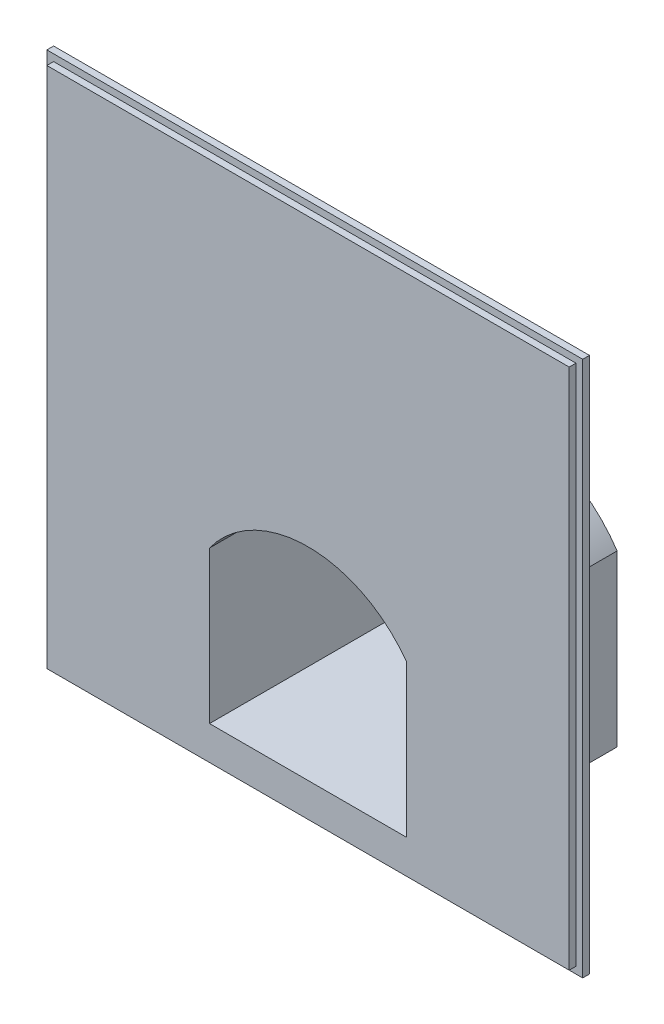
ISO-10303-21;
HEADER;
FILE_DESCRIPTION(('STEP AP214'),'2;1');
FILE_NAME('part.step','',(''),(''),'','','');
FILE_SCHEMA(('AUTOMOTIVE_DESIGN { 1 0 10303 214 1 1 1 1 }'));
ENDSEC;
DATA;
#1=APPLICATION_CONTEXT('core data for automotive mechanical design processes');
#2=APPLICATION_PROTOCOL_DEFINITION('international standard','automotive_design',2000,#1);
#3=PRODUCT_CONTEXT('',#1,'mechanical');
#4=PRODUCT('Part','Part','',(#3));
#5=PRODUCT_RELATED_PRODUCT_CATEGORY('part','',(#4));
#6=PRODUCT_DEFINITION_FORMATION('','',#4);
#7=PRODUCT_DEFINITION_CONTEXT('part definition',#1,'design');
#8=PRODUCT_DEFINITION('design','',#6,#7);
#9=PRODUCT_DEFINITION_SHAPE('','',#8);
#10=(LENGTH_UNIT() NAMED_UNIT(*) SI_UNIT(.MILLI.,.METRE.));
#11=(NAMED_UNIT(*) PLANE_ANGLE_UNIT() SI_UNIT($,.RADIAN.));
#12=(NAMED_UNIT(*) SI_UNIT($,.STERADIAN.) SOLID_ANGLE_UNIT());
#13=UNCERTAINTY_MEASURE_WITH_UNIT(LENGTH_MEASURE(1.E-05),#10,'distance_accuracy_value','');
#14=(GEOMETRIC_REPRESENTATION_CONTEXT(3) GLOBAL_UNCERTAINTY_ASSIGNED_CONTEXT((#13)) GLOBAL_UNIT_ASSIGNED_CONTEXT((#10,
#11,#12)) REPRESENTATION_CONTEXT('',''));
#15=CARTESIAN_POINT('',(0.,0.,0.));
#16=DIRECTION('',(0.,0.,1.));
#17=DIRECTION('',(1.,0.,0.));
#18=AXIS2_PLACEMENT_3D('',#15,#16,#17);
#19=CARTESIAN_POINT('',(-19.85,-19.85,1.));
#20=DIRECTION('',(0.,1.,0.));
#21=DIRECTION('',(0.,0.,1.));
#22=AXIS2_PLACEMENT_3D('',#19,#20,#21);
#23=PLANE('',#22);
#24=DIRECTION('',(1.,0.,0.));
#25=VECTOR('',#24,1.);
#26=CARTESIAN_POINT('',(-19.85,-19.85,0.5));
#27=LINE('',#26,#25);
#28=CARTESIAN_POINT('',(-19.85,-19.85,0.5));
#29=VERTEX_POINT('',#28);
#30=CARTESIAN_POINT('',(19.85,-19.85,0.5));
#31=VERTEX_POINT('',#30);
#32=EDGE_CURVE('E297',#29,#31,#27,.T.);
#33=ORIENTED_EDGE('',*,*,#32,.F.);
#34=DIRECTION('',(0.,0.,-1.));
#35=VECTOR('',#34,1.);
#36=CARTESIAN_POINT('',(-19.85,-19.85,1.));
#37=LINE('',#36,#35);
#38=CARTESIAN_POINT('',(-19.85,-19.85,0.));
#39=VERTEX_POINT('',#38);
#40=EDGE_CURVE('E380',#29,#39,#37,.T.);
#41=ORIENTED_EDGE('',*,*,#40,.T.);
#42=DIRECTION('',(1.,0.,0.));
#43=VECTOR('',#42,1.);
#44=CARTESIAN_POINT('',(-19.85,-19.85,0.));
#45=LINE('',#44,#43);
#46=CARTESIAN_POINT('',(19.85,-19.85,0.));
#47=VERTEX_POINT('',#46);
#48=EDGE_CURVE('E368',#39,#47,#45,.T.);
#49=ORIENTED_EDGE('',*,*,#48,.T.);
#50=DIRECTION('',(0.,0.,-1.));
#51=VECTOR('',#50,1.);
#52=CARTESIAN_POINT('',(19.85,-19.85,1.));
#53=LINE('',#52,#51);
#54=EDGE_CURVE('E11',#31,#47,#53,.T.);
#55=ORIENTED_EDGE('',*,*,#54,.F.);
#56=EDGE_LOOP('',(#33,#41,#49,#55));
#57=FACE_BOUND('',#56,.T.);
#58=ADVANCED_FACE('F35',(#57),#23,.F.);
#59=CARTESIAN_POINT('',(19.85,-19.85,1.));
#60=DIRECTION('',(-1.,0.,0.));
#61=DIRECTION('',(0.,-1.,0.));
#62=AXIS2_PLACEMENT_3D('',#59,#60,#61);
#63=PLANE('',#62);
#64=DIRECTION('',(0.,1.,0.));
#65=VECTOR('',#64,1.);
#66=CARTESIAN_POINT('',(19.85,-19.85,0.5));
#67=LINE('',#66,#65);
#68=CARTESIAN_POINT('',(19.85,19.85,0.5));
#69=VERTEX_POINT('',#68);
#70=EDGE_CURVE('E299',#31,#69,#67,.T.);
#71=ORIENTED_EDGE('',*,*,#70,.F.);
#72=ORIENTED_EDGE('',*,*,#54,.T.);
#73=DIRECTION('',(0.,1.,0.));
#74=VECTOR('',#73,1.);
#75=CARTESIAN_POINT('',(19.85,-19.85,0.));
#76=LINE('',#75,#74);
#77=CARTESIAN_POINT('',(19.85,19.85,0.));
#78=VERTEX_POINT('',#77);
#79=EDGE_CURVE('E371',#47,#78,#76,.T.);
#80=ORIENTED_EDGE('',*,*,#79,.T.);
#81=DIRECTION('',(0.,0.,-1.));
#82=VECTOR('',#81,1.);
#83=CARTESIAN_POINT('',(19.85,19.85,1.));
#84=LINE('',#83,#82);
#85=EDGE_CURVE('E42',#69,#78,#84,.T.);
#86=ORIENTED_EDGE('',*,*,#85,.F.);
#87=EDGE_LOOP('',(#71,#72,#80,#86));
#88=FACE_BOUND('',#87,.T.);
#89=ADVANCED_FACE('F393',(#88),#63,.F.);
#90=CARTESIAN_POINT('',(19.85,19.85,1.));
#91=DIRECTION('',(0.,-1.,0.));
#92=DIRECTION('',(1.,0.,0.));
#93=AXIS2_PLACEMENT_3D('',#90,#91,#92);
#94=PLANE('',#93);
#95=DIRECTION('',(-1.,0.,0.));
#96=VECTOR('',#95,1.);
#97=CARTESIAN_POINT('',(19.85,19.85,0.5));
#98=LINE('',#97,#96);
#99=CARTESIAN_POINT('',(-19.85,19.85,0.5));
#100=VERTEX_POINT('',#99);
#101=EDGE_CURVE('E301',#69,#100,#98,.T.);
#102=ORIENTED_EDGE('',*,*,#101,.F.);
#103=ORIENTED_EDGE('',*,*,#85,.T.);
#104=DIRECTION('',(-1.,0.,0.));
#105=VECTOR('',#104,1.);
#106=CARTESIAN_POINT('',(19.85,19.85,0.));
#107=LINE('',#106,#105);
#108=CARTESIAN_POINT('',(-19.85,19.85,0.));
#109=VERTEX_POINT('',#108);
#110=EDGE_CURVE('E374',#78,#109,#107,.T.);
#111=ORIENTED_EDGE('',*,*,#110,.T.);
#112=DIRECTION('',(0.,0.,-1.));
#113=VECTOR('',#112,1.);
#114=CARTESIAN_POINT('',(-19.85,19.85,1.));
#115=LINE('',#114,#113);
#116=EDGE_CURVE('E382',#100,#109,#115,.T.);
#117=ORIENTED_EDGE('',*,*,#116,.F.);
#118=EDGE_LOOP('',(#102,#103,#111,#117));
#119=FACE_BOUND('',#118,.T.);
#120=ADVANCED_FACE('F386',(#119),#94,.F.);
#121=CARTESIAN_POINT('',(-19.85,19.85,1.));
#122=DIRECTION('',(1.,0.,0.));
#123=DIRECTION('',(0.,1.,0.));
#124=AXIS2_PLACEMENT_3D('',#121,#122,#123);
#125=PLANE('',#124);
#126=DIRECTION('',(0.,-1.,0.));
#127=VECTOR('',#126,1.);
#128=CARTESIAN_POINT('',(-19.85,19.85,0.5));
#129=LINE('',#128,#127);
#130=EDGE_CURVE('E289',#100,#29,#129,.T.);
#131=ORIENTED_EDGE('',*,*,#130,.F.);
#132=ORIENTED_EDGE('',*,*,#116,.T.);
#133=DIRECTION('',(0.,-1.,0.));
#134=VECTOR('',#133,1.);
#135=CARTESIAN_POINT('',(-19.85,19.85,0.));
#136=LINE('',#135,#134);
#137=EDGE_CURVE('E377',#109,#39,#136,.T.);
#138=ORIENTED_EDGE('',*,*,#137,.T.);
#139=ORIENTED_EDGE('',*,*,#40,.F.);
#140=EDGE_LOOP('',(#131,#132,#138,#139));
#141=FACE_BOUND('',#140,.T.);
#142=ADVANCED_FACE('F401',(#141),#125,.F.);
#143=CARTESIAN_POINT('',(0.,0.,0.));
#144=DIRECTION('',(0.,0.,1.));
#145=DIRECTION('',(1.,0.,0.));
#146=AXIS2_PLACEMENT_3D('',#143,#144,#145);
#147=PLANE('',#146);
#148=DIRECTION('',(0.,-1.,0.));
#149=VECTOR('',#148,1.);
#150=CARTESIAN_POINT('',(8.3,-17.85,0.));
#151=LINE('',#150,#149);
#152=CARTESIAN_POINT('',(8.3,-5.27236609304627,0.));
#153=VERTEX_POINT('',#152);
#154=CARTESIAN_POINT('',(8.3,-17.85,0.));
#155=VERTEX_POINT('',#154);
#156=EDGE_CURVE('E319',#153,#155,#151,.T.);
#157=ORIENTED_EDGE('',*,*,#156,.F.);
#158=CARTESIAN_POINT('',(0.,-10.85,0.));
#159=DIRECTION('',(0.,0.,-1.));
#160=DIRECTION('',(-1.,0.,0.));
#161=AXIS2_PLACEMENT_3D('',#158,#159,#160);
#162=CIRCLE('',#161,10.);
#163=CARTESIAN_POINT('',(-8.3,-5.27236609304627,0.));
#164=VERTEX_POINT('',#163);
#165=EDGE_CURVE('E340',#164,#153,#162,.T.);
#166=ORIENTED_EDGE('',*,*,#165,.F.);
#167=DIRECTION('',(0.,1.,0.));
#168=VECTOR('',#167,1.);
#169=CARTESIAN_POINT('',(-8.3,-17.85,0.));
#170=LINE('',#169,#168);
#171=CARTESIAN_POINT('',(-8.3,-17.85,0.));
#172=VERTEX_POINT('',#171);
#173=EDGE_CURVE('E352',#172,#164,#170,.T.);
#174=ORIENTED_EDGE('',*,*,#173,.F.);
#175=DIRECTION('',(-1.,0.,0.));
#176=VECTOR('',#175,1.);
#177=CARTESIAN_POINT('',(8.3,-17.85,0.));
#178=LINE('',#177,#176);
#179=EDGE_CURVE('E349',#155,#172,#178,.T.);
#180=ORIENTED_EDGE('',*,*,#179,.F.);
#181=EDGE_LOOP('',(#157,#166,#174,#180));
#182=FACE_BOUND('',#181,.T.);
#183=ORIENTED_EDGE('',*,*,#48,.F.);
#184=ORIENTED_EDGE('',*,*,#137,.F.);
#185=ORIENTED_EDGE('',*,*,#110,.F.);
#186=ORIENTED_EDGE('',*,*,#79,.F.);
#187=EDGE_LOOP('',(#183,#184,#185,#186));
#188=FACE_BOUND('',#187,.T.);
#189=ADVANCED_FACE('F397',(#182,#188),#147,.F.);
#190=CARTESIAN_POINT('',(8.3,-17.85,-13.6));
#191=DIRECTION('',(-1.,0.,0.));
#192=DIRECTION('',(0.,0.,1.));
#193=AXIS2_PLACEMENT_3D('',#190,#191,#192);
#194=PLANE('',#193);
#195=ORIENTED_EDGE('',*,*,#156,.T.);
#196=DIRECTION('',(0.,0.,1.));
#197=VECTOR('',#196,1.);
#198=CARTESIAN_POINT('',(8.3,-17.85,-13.6));
#199=LINE('',#198,#197);
#200=CARTESIAN_POINT('',(8.3,-17.85,-13.6));
#201=VERTEX_POINT('',#200);
#202=EDGE_CURVE('E365',#201,#155,#199,.T.);
#203=ORIENTED_EDGE('',*,*,#202,.F.);
#204=DIRECTION('',(0.,-1.,0.));
#205=VECTOR('',#204,1.);
#206=CARTESIAN_POINT('',(8.3,-17.85,-13.6));
#207=LINE('',#206,#205);
#208=CARTESIAN_POINT('',(8.3,-5.27236609304627,-13.6));
#209=VERTEX_POINT('',#208);
#210=EDGE_CURVE('E336',#209,#201,#207,.T.);
#211=ORIENTED_EDGE('',*,*,#210,.F.);
#212=DIRECTION('',(0.,0.,1.));
#213=VECTOR('',#212,1.);
#214=CARTESIAN_POINT('',(8.3,-5.27236609304627,-13.6));
#215=LINE('',#214,#213);
#216=EDGE_CURVE('E346',#209,#153,#215,.T.);
#217=ORIENTED_EDGE('',*,*,#216,.T.);
#218=EDGE_LOOP('',(#195,#203,#211,#217));
#219=FACE_BOUND('',#218,.T.);
#220=ADVANCED_FACE('F419',(#219),#194,.F.);
#221=CARTESIAN_POINT('',(8.3,-17.85,-13.6));
#222=DIRECTION('',(0.,1.,0.));
#223=DIRECTION('',(0.,0.,1.));
#224=AXIS2_PLACEMENT_3D('',#221,#222,#223);
#225=PLANE('',#224);
#226=ORIENTED_EDGE('',*,*,#179,.T.);
#227=DIRECTION('',(0.,0.,1.));
#228=VECTOR('',#227,1.);
#229=CARTESIAN_POINT('',(-8.3,-17.85,-13.6));
#230=LINE('',#229,#228);
#231=CARTESIAN_POINT('',(-8.3,-17.85,-13.6));
#232=VERTEX_POINT('',#231);
#233=EDGE_CURVE('E362',#232,#172,#230,.T.);
#234=ORIENTED_EDGE('',*,*,#233,.F.);
#235=DIRECTION('',(-1.,0.,0.));
#236=VECTOR('',#235,1.);
#237=CARTESIAN_POINT('',(8.3,-17.85,-13.6));
#238=LINE('',#237,#236);
#239=EDGE_CURVE('E339',#201,#232,#238,.T.);
#240=ORIENTED_EDGE('',*,*,#239,.F.);
#241=ORIENTED_EDGE('',*,*,#202,.T.);
#242=EDGE_LOOP('',(#226,#234,#240,#241));
#243=FACE_BOUND('',#242,.T.);
#244=ADVANCED_FACE('F429',(#243),#225,.F.);
#245=CARTESIAN_POINT('',(-8.3,-17.85,-13.6));
#246=DIRECTION('',(1.,0.,0.));
#247=DIRECTION('',(0.,0.,-1.));
#248=AXIS2_PLACEMENT_3D('',#245,#246,#247);
#249=PLANE('',#248);
#250=ORIENTED_EDGE('',*,*,#173,.T.);
#251=DIRECTION('',(0.,0.,1.));
#252=VECTOR('',#251,1.);
#253=CARTESIAN_POINT('',(-8.3,-5.27236609304627,-13.6));
#254=LINE('',#253,#252);
#255=CARTESIAN_POINT('',(-8.3,-5.27236609304627,-13.6));
#256=VERTEX_POINT('',#255);
#257=EDGE_CURVE('E359',#256,#164,#254,.T.);
#258=ORIENTED_EDGE('',*,*,#257,.F.);
#259=DIRECTION('',(0.,1.,0.));
#260=VECTOR('',#259,1.);
#261=CARTESIAN_POINT('',(-8.3,-17.85,-13.6));
#262=LINE('',#261,#260);
#263=EDGE_CURVE('E342',#232,#256,#262,.T.);
#264=ORIENTED_EDGE('',*,*,#263,.F.);
#265=ORIENTED_EDGE('',*,*,#233,.T.);
#266=EDGE_LOOP('',(#250,#258,#264,#265));
#267=FACE_BOUND('',#266,.T.);
#268=ADVANCED_FACE('F433',(#267),#249,.F.);
#269=CARTESIAN_POINT('',(0.,-10.85,-13.6));
#270=DIRECTION('',(0.,0.,1.));
#271=DIRECTION('',(1.,0.,0.));
#272=AXIS2_PLACEMENT_3D('',#269,#270,#271);
#273=CYLINDRICAL_SURFACE('',#272,10.);
#274=ORIENTED_EDGE('',*,*,#165,.T.);
#275=ORIENTED_EDGE('',*,*,#216,.F.);
#276=CARTESIAN_POINT('',(0.,-10.85,-13.6));
#277=DIRECTION('',(0.,0.,-1.));
#278=DIRECTION('',(-1.,0.,0.));
#279=AXIS2_PLACEMENT_3D('',#276,#277,#278);
#280=CIRCLE('',#279,10.);
#281=EDGE_CURVE('E344',#256,#209,#280,.T.);
#282=ORIENTED_EDGE('',*,*,#281,.F.);
#283=ORIENTED_EDGE('',*,*,#257,.T.);
#284=EDGE_LOOP('',(#274,#275,#282,#283));
#285=FACE_BOUND('',#284,.T.);
#286=ADVANCED_FACE('F437',(#285),#273,.T.);
#287=CARTESIAN_POINT('',(0.,-10.85,-13.6));
#288=DIRECTION('',(0.,0.,-1.));
#289=DIRECTION('',(-1.,0.,0.));
#290=AXIS2_PLACEMENT_3D('',#287,#288,#289);
#291=PLANE('',#290);
#292=DIRECTION('',(0.,-1.,0.));
#293=VECTOR('',#292,1.);
#294=CARTESIAN_POINT('',(6.5,-15.55,-13.6));
#295=LINE('',#294,#293);
#296=CARTESIAN_POINT('',(6.5,-15.55,-13.6));
#297=VERTEX_POINT('',#296);
#298=CARTESIAN_POINT('',(6.5,-15.85,-13.6));
#299=VERTEX_POINT('',#298);
#300=EDGE_CURVE('E49',#297,#299,#295,.T.);
#301=ORIENTED_EDGE('',*,*,#300,.F.);
#302=DIRECTION('',(1.,0.,0.));
#303=VECTOR('',#302,1.);
#304=CARTESIAN_POINT('',(6.5,-15.55,-13.6));
#305=LINE('',#304,#303);
#306=CARTESIAN_POINT('',(4.5,-15.55,-13.6));
#307=VERTEX_POINT('',#306);
#308=EDGE_CURVE('E202',#307,#297,#305,.T.);
#309=ORIENTED_EDGE('',*,*,#308,.F.);
#310=DIRECTION('',(0.,1.,0.));
#311=VECTOR('',#310,1.);
#312=CARTESIAN_POINT('',(4.5,-15.55,-13.6));
#313=LINE('',#312,#311);
#314=CARTESIAN_POINT('',(4.5,-15.85,-13.6));
#315=VERTEX_POINT('',#314);
#316=EDGE_CURVE('E225',#315,#307,#313,.T.);
#317=ORIENTED_EDGE('',*,*,#316,.F.);
#318=DIRECTION('',(-1.,0.,0.));
#319=VECTOR('',#318,1.);
#320=CARTESIAN_POINT('',(6.5,-15.85,-13.6));
#321=LINE('',#320,#319);
#322=EDGE_CURVE('E218',#299,#315,#321,.T.);
#323=ORIENTED_EDGE('',*,*,#322,.F.);
#324=EDGE_LOOP('',(#301,#309,#317,#323));
#325=FACE_BOUND('',#324,.T.);
#326=DIRECTION('',(1.,0.,0.));
#327=VECTOR('',#326,1.);
#328=CARTESIAN_POINT('',(-6.5,-15.55,-13.6));
#329=LINE('',#328,#327);
#330=CARTESIAN_POINT('',(-6.5,-15.55,-13.6));
#331=VERTEX_POINT('',#330);
#332=CARTESIAN_POINT('',(-4.5,-15.55,-13.6));
#333=VERTEX_POINT('',#332);
#334=EDGE_CURVE('E57',#331,#333,#329,.T.);
#335=ORIENTED_EDGE('',*,*,#334,.F.);
#336=DIRECTION('',(0.,1.,0.));
#337=VECTOR('',#336,1.);
#338=CARTESIAN_POINT('',(-6.5,-15.55,-13.6));
#339=LINE('',#338,#337);
#340=CARTESIAN_POINT('',(-6.5,-15.85,-13.6));
#341=VERTEX_POINT('',#340);
#342=EDGE_CURVE('E249',#341,#331,#339,.T.);
#343=ORIENTED_EDGE('',*,*,#342,.F.);
#344=DIRECTION('',(-1.,0.,0.));
#345=VECTOR('',#344,1.);
#346=CARTESIAN_POINT('',(-6.5,-15.85,-13.6));
#347=LINE('',#346,#345);
#348=CARTESIAN_POINT('',(-4.5,-15.85,-13.6));
#349=VERTEX_POINT('',#348);
#350=EDGE_CURVE('E246',#349,#341,#347,.T.);
#351=ORIENTED_EDGE('',*,*,#350,.F.);
#352=DIRECTION('',(0.,-1.,0.));
#353=VECTOR('',#352,1.);
#354=CARTESIAN_POINT('',(-4.5,-15.55,-13.6));
#355=LINE('',#354,#353);
#356=EDGE_CURVE('E243',#333,#349,#355,.T.);
#357=ORIENTED_EDGE('',*,*,#356,.F.);
#358=EDGE_LOOP('',(#335,#343,#351,#357));
#359=FACE_BOUND('',#358,.T.);
#360=ORIENTED_EDGE('',*,*,#210,.T.);
#361=ORIENTED_EDGE('',*,*,#239,.T.);
#362=ORIENTED_EDGE('',*,*,#263,.T.);
#363=ORIENTED_EDGE('',*,*,#281,.T.);
#364=EDGE_LOOP('',(#360,#361,#362,#363));
#365=FACE_BOUND('',#364,.T.);
#366=ADVANCED_FACE('F441',(#325,#359,#365),#291,.T.);
#367=CARTESIAN_POINT('',(0.,0.,0.5));
#368=DIRECTION('',(0.,0.,1.));
#369=DIRECTION('',(1.,0.,0.));
#370=AXIS2_PLACEMENT_3D('',#367,#368,#369);
#371=PLANE('',#370);
#372=DIRECTION('',(-1.,0.,0.));
#373=VECTOR('',#372,1.);
#374=CARTESIAN_POINT('',(-19.35,19.35,0.5));
#375=LINE('',#374,#373);
#376=CARTESIAN_POINT('',(19.35,19.35,0.5));
#377=VERTEX_POINT('',#376);
#378=CARTESIAN_POINT('',(-19.35,19.35,0.5));
#379=VERTEX_POINT('',#378);
#380=EDGE_CURVE('E273',#377,#379,#375,.T.);
#381=ORIENTED_EDGE('',*,*,#380,.F.);
#382=DIRECTION('',(0.,1.,0.));
#383=VECTOR('',#382,1.);
#384=CARTESIAN_POINT('',(19.35,19.35,0.5));
#385=LINE('',#384,#383);
#386=CARTESIAN_POINT('',(19.35,-19.35,0.5));
#387=VERTEX_POINT('',#386);
#388=EDGE_CURVE('E270',#387,#377,#385,.T.);
#389=ORIENTED_EDGE('',*,*,#388,.F.);
#390=DIRECTION('',(1.,0.,0.));
#391=VECTOR('',#390,1.);
#392=CARTESIAN_POINT('',(-19.35,-19.35,0.5));
#393=LINE('',#392,#391);
#394=CARTESIAN_POINT('',(-19.35,-19.35,0.5));
#395=VERTEX_POINT('',#394);
#396=EDGE_CURVE('E266',#395,#387,#393,.T.);
#397=ORIENTED_EDGE('',*,*,#396,.F.);
#398=DIRECTION('',(0.,-1.,0.));
#399=VECTOR('',#398,1.);
#400=CARTESIAN_POINT('',(-19.35,19.35,0.5));
#401=LINE('',#400,#399);
#402=EDGE_CURVE('E263',#379,#395,#401,.T.);
#403=ORIENTED_EDGE('',*,*,#402,.F.);
#404=EDGE_LOOP('',(#381,#389,#397,#403));
#405=FACE_BOUND('',#404,.T.);
#406=ORIENTED_EDGE('',*,*,#130,.T.);
#407=ORIENTED_EDGE('',*,*,#32,.T.);
#408=ORIENTED_EDGE('',*,*,#70,.T.);
#409=ORIENTED_EDGE('',*,*,#101,.T.);
#410=EDGE_LOOP('',(#406,#407,#408,#409));
#411=FACE_BOUND('',#410,.T.);
#412=ADVANCED_FACE('F404',(#405,#411),#371,.T.);
#413=CARTESIAN_POINT('',(-19.35,19.35,0.5));
#414=DIRECTION('',(-1.,0.,0.));
#415=DIRECTION('',(0.,-1.,0.));
#416=AXIS2_PLACEMENT_3D('',#413,#414,#415);
#417=PLANE('',#416);
#418=DIRECTION('',(0.,-1.,0.));
#419=VECTOR('',#418,1.);
#420=CARTESIAN_POINT('',(-19.35,19.35,1.));
#421=LINE('',#420,#419);
#422=CARTESIAN_POINT('',(-19.35,19.35,1.));
#423=VERTEX_POINT('',#422);
#424=CARTESIAN_POINT('',(-19.35,-19.35,1.));
#425=VERTEX_POINT('',#424);
#426=EDGE_CURVE('E210',#423,#425,#421,.T.);
#427=ORIENTED_EDGE('',*,*,#426,.F.);
#428=DIRECTION('',(0.,0.,1.));
#429=VECTOR('',#428,1.);
#430=CARTESIAN_POINT('',(-19.35,19.35,0.5));
#431=LINE('',#430,#429);
#432=EDGE_CURVE('E287',#379,#423,#431,.T.);
#433=ORIENTED_EDGE('',*,*,#432,.F.);
#434=ORIENTED_EDGE('',*,*,#402,.T.);
#435=DIRECTION('',(0.,0.,1.));
#436=VECTOR('',#435,1.);
#437=CARTESIAN_POINT('',(-19.35,-19.35,0.5));
#438=LINE('',#437,#436);
#439=EDGE_CURVE('E276',#395,#425,#438,.T.);
#440=ORIENTED_EDGE('',*,*,#439,.T.);
#441=EDGE_LOOP('',(#427,#433,#434,#440));
#442=FACE_BOUND('',#441,.T.);
#443=ADVANCED_FACE('F466',(#442),#417,.T.);
#444=CARTESIAN_POINT('',(-19.35,19.35,0.5));
#445=DIRECTION('',(0.,1.,0.));
#446=DIRECTION('',(0.,0.,1.));
#447=AXIS2_PLACEMENT_3D('',#444,#445,#446);
#448=PLANE('',#447);
#449=DIRECTION('',(-1.,0.,0.));
#450=VECTOR('',#449,1.);
#451=CARTESIAN_POINT('',(-19.35,19.35,1.));
#452=LINE('',#451,#450);
#453=CARTESIAN_POINT('',(19.35,19.35,1.));
#454=VERTEX_POINT('',#453);
#455=EDGE_CURVE('E267',#454,#423,#452,.T.);
#456=ORIENTED_EDGE('',*,*,#455,.F.);
#457=DIRECTION('',(0.,0.,1.));
#458=VECTOR('',#457,1.);
#459=CARTESIAN_POINT('',(19.35,19.35,0.5));
#460=LINE('',#459,#458);
#461=EDGE_CURVE('E290',#377,#454,#460,.T.);
#462=ORIENTED_EDGE('',*,*,#461,.F.);
#463=ORIENTED_EDGE('',*,*,#380,.T.);
#464=ORIENTED_EDGE('',*,*,#432,.T.);
#465=EDGE_LOOP('',(#456,#462,#463,#464));
#466=FACE_BOUND('',#465,.T.);
#467=ADVANCED_FACE('F470',(#466),#448,.T.);
#468=CARTESIAN_POINT('',(19.35,19.35,0.5));
#469=DIRECTION('',(1.,0.,0.));
#470=DIRECTION('',(0.,1.,0.));
#471=AXIS2_PLACEMENT_3D('',#468,#469,#470);
#472=PLANE('',#471);
#473=DIRECTION('',(0.,1.,0.));
#474=VECTOR('',#473,1.);
#475=CARTESIAN_POINT('',(19.35,19.35,1.));
#476=LINE('',#475,#474);
#477=CARTESIAN_POINT('',(19.35,-19.35,1.));
#478=VERTEX_POINT('',#477);
#479=EDGE_CURVE('E282',#478,#454,#476,.T.);
#480=ORIENTED_EDGE('',*,*,#479,.F.);
#481=DIRECTION('',(0.,0.,1.));
#482=VECTOR('',#481,1.);
#483=CARTESIAN_POINT('',(19.35,-19.35,0.5));
#484=LINE('',#483,#482);
#485=EDGE_CURVE('E292',#387,#478,#484,.T.);
#486=ORIENTED_EDGE('',*,*,#485,.F.);
#487=ORIENTED_EDGE('',*,*,#388,.T.);
#488=ORIENTED_EDGE('',*,*,#461,.T.);
#489=EDGE_LOOP('',(#480,#486,#487,#488));
#490=FACE_BOUND('',#489,.T.);
#491=ADVANCED_FACE('F474',(#490),#472,.T.);
#492=CARTESIAN_POINT('',(-19.35,-19.35,0.5));
#493=DIRECTION('',(0.,-1.,0.));
#494=DIRECTION('',(0.,0.,-1.));
#495=AXIS2_PLACEMENT_3D('',#492,#493,#494);
#496=PLANE('',#495);
#497=DIRECTION('',(1.,0.,0.));
#498=VECTOR('',#497,1.);
#499=CARTESIAN_POINT('',(-19.35,-19.35,1.));
#500=LINE('',#499,#498);
#501=EDGE_CURVE('E279',#425,#478,#500,.T.);
#502=ORIENTED_EDGE('',*,*,#501,.F.);
#503=ORIENTED_EDGE('',*,*,#439,.F.);
#504=ORIENTED_EDGE('',*,*,#396,.T.);
#505=ORIENTED_EDGE('',*,*,#485,.T.);
#506=EDGE_LOOP('',(#502,#503,#504,#505));
#507=FACE_BOUND('',#506,.T.);
#508=ADVANCED_FACE('F449',(#507),#496,.T.);
#509=CARTESIAN_POINT('',(0.,-10.85,-12.6));
#510=DIRECTION('',(0.,0.,-1.));
#511=DIRECTION('',(-1.,0.,0.));
#512=AXIS2_PLACEMENT_3D('',#509,#510,#511);
#513=PLANE('',#512);
#514=DIRECTION('',(-1.,0.,0.));
#515=VECTOR('',#514,1.);
#516=CARTESIAN_POINT('',(6.5,-15.55,-12.6));
#517=LINE('',#516,#515);
#518=CARTESIAN_POINT('',(6.5,-15.55,-12.6));
#519=VERTEX_POINT('',#518);
#520=CARTESIAN_POINT('',(4.5,-15.55,-12.6));
#521=VERTEX_POINT('',#520);
#522=EDGE_CURVE('E216',#519,#521,#517,.T.);
#523=ORIENTED_EDGE('',*,*,#522,.F.);
#524=DIRECTION('',(0.,1.,0.));
#525=VECTOR('',#524,1.);
#526=CARTESIAN_POINT('',(6.5,-15.55,-12.6));
#527=LINE('',#526,#525);
#528=CARTESIAN_POINT('',(6.5,-15.85,-12.6));
#529=VERTEX_POINT('',#528);
#530=EDGE_CURVE('E196',#529,#519,#527,.T.);
#531=ORIENTED_EDGE('',*,*,#530,.F.);
#532=DIRECTION('',(1.,0.,0.));
#533=VECTOR('',#532,1.);
#534=CARTESIAN_POINT('',(6.5,-15.85,-12.6));
#535=LINE('',#534,#533);
#536=CARTESIAN_POINT('',(4.5,-15.85,-12.6));
#537=VERTEX_POINT('',#536);
#538=EDGE_CURVE('E206',#537,#529,#535,.T.);
#539=ORIENTED_EDGE('',*,*,#538,.F.);
#540=DIRECTION('',(0.,-1.,0.));
#541=VECTOR('',#540,1.);
#542=CARTESIAN_POINT('',(4.5,-15.55,-12.6));
#543=LINE('',#542,#541);
#544=EDGE_CURVE('E220',#521,#537,#543,.T.);
#545=ORIENTED_EDGE('',*,*,#544,.F.);
#546=EDGE_LOOP('',(#523,#531,#539,#545));
#547=FACE_BOUND('',#546,.T.);
#548=DIRECTION('',(0.,-1.,0.));
#549=VECTOR('',#548,1.);
#550=CARTESIAN_POINT('',(-6.5,-15.55,-12.6));
#551=LINE('',#550,#549);
#552=CARTESIAN_POINT('',(-6.5,-15.55,-12.6));
#553=VERTEX_POINT('',#552);
#554=CARTESIAN_POINT('',(-6.5,-15.85,-12.6));
#555=VERTEX_POINT('',#554);
#556=EDGE_CURVE('E236',#553,#555,#551,.T.);
#557=ORIENTED_EDGE('',*,*,#556,.F.);
#558=DIRECTION('',(-1.,0.,0.));
#559=VECTOR('',#558,1.);
#560=CARTESIAN_POINT('',(-6.5,-15.55,-12.6));
#561=LINE('',#560,#559);
#562=CARTESIAN_POINT('',(-4.5,-15.55,-12.6));
#563=VERTEX_POINT('',#562);
#564=EDGE_CURVE('E239',#563,#553,#561,.T.);
#565=ORIENTED_EDGE('',*,*,#564,.F.);
#566=DIRECTION('',(0.,1.,0.));
#567=VECTOR('',#566,1.);
#568=CARTESIAN_POINT('',(-4.5,-15.55,-12.6));
#569=LINE('',#568,#567);
#570=CARTESIAN_POINT('',(-4.5,-15.85,-12.6));
#571=VERTEX_POINT('',#570);
#572=EDGE_CURVE('E255',#571,#563,#569,.T.);
#573=ORIENTED_EDGE('',*,*,#572,.F.);
#574=DIRECTION('',(1.,0.,0.));
#575=VECTOR('',#574,1.);
#576=CARTESIAN_POINT('',(-6.5,-15.85,-12.6));
#577=LINE('',#576,#575);
#578=EDGE_CURVE('E234',#555,#571,#577,.T.);
#579=ORIENTED_EDGE('',*,*,#578,.F.);
#580=EDGE_LOOP('',(#557,#565,#573,#579));
#581=FACE_BOUND('',#580,.T.);
#582=DIRECTION('',(0.,-1.,0.));
#583=VECTOR('',#582,1.);
#584=CARTESIAN_POINT('',(7.3,-17.85,-12.6));
#585=LINE('',#584,#583);
#586=CARTESIAN_POINT('',(7.3,-5.58597112469779,-12.6));
#587=VERTEX_POINT('',#586);
#588=CARTESIAN_POINT('',(7.3,-16.85,-12.6));
#589=VERTEX_POINT('',#588);
#590=EDGE_CURVE('E310',#587,#589,#585,.T.);
#591=ORIENTED_EDGE('',*,*,#590,.F.);
#592=CARTESIAN_POINT('',(0.,-10.85,-12.6));
#593=DIRECTION('',(0.,0.,-1.));
#594=DIRECTION('',(-1.,0.,0.));
#595=AXIS2_PLACEMENT_3D('',#592,#593,#594);
#596=CIRCLE('',#595,9.00000000000001);
#597=CARTESIAN_POINT('',(-7.3,-5.58597112469779,-12.6));
#598=VERTEX_POINT('',#597);
#599=EDGE_CURVE('E327',#598,#587,#596,.T.);
#600=ORIENTED_EDGE('',*,*,#599,.F.);
#601=DIRECTION('',(0.,1.,0.));
#602=VECTOR('',#601,1.);
#603=CARTESIAN_POINT('',(-7.3,-17.85,-12.6));
#604=LINE('',#603,#602);
#605=CARTESIAN_POINT('',(-7.3,-16.85,-12.6));
#606=VERTEX_POINT('',#605);
#607=EDGE_CURVE('E331',#606,#598,#604,.T.);
#608=ORIENTED_EDGE('',*,*,#607,.F.);
#609=DIRECTION('',(-1.,0.,0.));
#610=VECTOR('',#609,1.);
#611=CARTESIAN_POINT('',(8.3,-16.85,-12.6));
#612=LINE('',#611,#610);
#613=EDGE_CURVE('E323',#589,#606,#612,.T.);
#614=ORIENTED_EDGE('',*,*,#613,.F.);
#615=EDGE_LOOP('',(#591,#600,#608,#614));
#616=FACE_BOUND('',#615,.T.);
#617=ADVANCED_FACE('F213',(#547,#581,#616),#513,.F.);
#618=CARTESIAN_POINT('',(7.3,-17.85,-13.6));
#619=DIRECTION('',(-1.,0.,0.));
#620=DIRECTION('',(0.,0.,1.));
#621=AXIS2_PLACEMENT_3D('',#618,#619,#620);
#622=PLANE('',#621);
#623=DIRECTION('',(0.,-1.,0.));
#624=VECTOR('',#623,1.);
#625=CARTESIAN_POINT('',(7.3,0.,1.));
#626=LINE('',#625,#624);
#627=CARTESIAN_POINT('',(7.3,-5.58597112469779,1.));
#628=VERTEX_POINT('',#627);
#629=CARTESIAN_POINT('',(7.3,-16.85,1.));
#630=VERTEX_POINT('',#629);
#631=EDGE_CURVE('E303',#628,#630,#626,.T.);
#632=ORIENTED_EDGE('',*,*,#631,.F.);
#633=DIRECTION('',(0.,0.,1.));
#634=VECTOR('',#633,1.);
#635=CARTESIAN_POINT('',(7.3,-5.58597112469779,-12.6));
#636=LINE('',#635,#634);
#637=EDGE_CURVE('E324',#587,#628,#636,.T.);
#638=ORIENTED_EDGE('',*,*,#637,.F.);
#639=ORIENTED_EDGE('',*,*,#590,.T.);
#640=DIRECTION('',(0.,0.,1.));
#641=VECTOR('',#640,1.);
#642=CARTESIAN_POINT('',(7.3,-16.85,-13.6));
#643=LINE('',#642,#641);
#644=EDGE_CURVE('E316',#589,#630,#643,.T.);
#645=ORIENTED_EDGE('',*,*,#644,.T.);
#646=EDGE_LOOP('',(#632,#638,#639,#645));
#647=FACE_BOUND('',#646,.T.);
#648=ADVANCED_FACE('F448',(#647),#622,.T.);
#649=CARTESIAN_POINT('',(0.,-10.85,-13.6));
#650=DIRECTION('',(0.,0.,1.));
#651=DIRECTION('',(1.,0.,0.));
#652=AXIS2_PLACEMENT_3D('',#649,#650,#651);
#653=CYLINDRICAL_SURFACE('',#652,9.00000000000001);
#654=CARTESIAN_POINT('',(0.,-10.85,0.999999999999999));
#655=DIRECTION('',(0.,0.,1.));
#656=DIRECTION('',(1.,0.,0.));
#657=AXIS2_PLACEMENT_3D('',#654,#655,#656);
#658=CIRCLE('',#657,9.00000000000001);
#659=CARTESIAN_POINT('',(-7.3,-5.58597112469779,1.));
#660=VERTEX_POINT('',#659);
#661=EDGE_CURVE('E307',#660,#628,#658,.F.);
#662=ORIENTED_EDGE('',*,*,#661,.F.);
#663=DIRECTION('',(0.,0.,1.));
#664=VECTOR('',#663,1.);
#665=CARTESIAN_POINT('',(-7.3,-5.58597112469779,-12.6));
#666=LINE('',#665,#664);
#667=EDGE_CURVE('E326',#598,#660,#666,.T.);
#668=ORIENTED_EDGE('',*,*,#667,.F.);
#669=ORIENTED_EDGE('',*,*,#599,.T.);
#670=ORIENTED_EDGE('',*,*,#637,.T.);
#671=EDGE_LOOP('',(#662,#668,#669,#670));
#672=FACE_BOUND('',#671,.T.);
#673=ADVANCED_FACE('F450',(#672),#653,.F.);
#674=CARTESIAN_POINT('',(-7.3,-17.85,-13.6));
#675=DIRECTION('',(1.,0.,0.));
#676=DIRECTION('',(0.,0.,-1.));
#677=AXIS2_PLACEMENT_3D('',#674,#675,#676);
#678=PLANE('',#677);
#679=DIRECTION('',(0.,1.,0.));
#680=VECTOR('',#679,1.);
#681=CARTESIAN_POINT('',(-7.3,0.,1.));
#682=LINE('',#681,#680);
#683=CARTESIAN_POINT('',(-7.3,-16.85,1.));
#684=VERTEX_POINT('',#683);
#685=EDGE_CURVE('E311',#684,#660,#682,.T.);
#686=ORIENTED_EDGE('',*,*,#685,.F.);
#687=DIRECTION('',(0.,0.,1.));
#688=VECTOR('',#687,1.);
#689=CARTESIAN_POINT('',(-7.3,-16.85,-13.6));
#690=LINE('',#689,#688);
#691=EDGE_CURVE('E320',#606,#684,#690,.T.);
#692=ORIENTED_EDGE('',*,*,#691,.F.);
#693=ORIENTED_EDGE('',*,*,#607,.T.);
#694=ORIENTED_EDGE('',*,*,#667,.T.);
#695=EDGE_LOOP('',(#686,#692,#693,#694));
#696=FACE_BOUND('',#695,.T.);
#697=ADVANCED_FACE('F453',(#696),#678,.T.);
#698=CARTESIAN_POINT('',(8.3,-16.85,-13.6));
#699=DIRECTION('',(0.,1.,0.));
#700=DIRECTION('',(0.,0.,1.));
#701=AXIS2_PLACEMENT_3D('',#698,#699,#700);
#702=PLANE('',#701);
#703=DIRECTION('',(-1.,0.,0.));
#704=VECTOR('',#703,1.);
#705=CARTESIAN_POINT('',(0.,-16.85,1.));
#706=LINE('',#705,#704);
#707=EDGE_CURVE('E306',#630,#684,#706,.T.);
#708=ORIENTED_EDGE('',*,*,#707,.F.);
#709=ORIENTED_EDGE('',*,*,#644,.F.);
#710=ORIENTED_EDGE('',*,*,#613,.T.);
#711=ORIENTED_EDGE('',*,*,#691,.T.);
#712=EDGE_LOOP('',(#708,#709,#710,#711));
#713=FACE_BOUND('',#712,.T.);
#714=ADVANCED_FACE('F425',(#713),#702,.T.);
#715=CARTESIAN_POINT('',(0.,0.,1.));
#716=DIRECTION('',(0.,0.,1.));
#717=DIRECTION('',(1.,0.,0.));
#718=AXIS2_PLACEMENT_3D('',#715,#716,#717);
#719=PLANE('',#718);
#720=ORIENTED_EDGE('',*,*,#707,.T.);
#721=ORIENTED_EDGE('',*,*,#685,.T.);
#722=ORIENTED_EDGE('',*,*,#661,.T.);
#723=ORIENTED_EDGE('',*,*,#631,.T.);
#724=EDGE_LOOP('',(#720,#721,#722,#723));
#725=FACE_BOUND('',#724,.T.);
#726=ORIENTED_EDGE('',*,*,#455,.T.);
#727=ORIENTED_EDGE('',*,*,#426,.T.);
#728=ORIENTED_EDGE('',*,*,#501,.T.);
#729=ORIENTED_EDGE('',*,*,#479,.T.);
#730=EDGE_LOOP('',(#726,#727,#728,#729));
#731=FACE_BOUND('',#730,.T.);
#732=ADVANCED_FACE('F421',(#725,#731),#719,.T.);
#733=CARTESIAN_POINT('',(-6.5,-15.55,1.001));
#734=DIRECTION('',(0.,1.,0.));
#735=DIRECTION('',(0.,0.,1.));
#736=AXIS2_PLACEMENT_3D('',#733,#734,#735);
#737=PLANE('',#736);
#738=ORIENTED_EDGE('',*,*,#564,.T.);
#739=DIRECTION('',(0.,0.,-1.));
#740=VECTOR('',#739,1.);
#741=CARTESIAN_POINT('',(-6.5,-15.55,1.001));
#742=LINE('',#741,#740);
#743=EDGE_CURVE('E253',#553,#331,#742,.T.);
#744=ORIENTED_EDGE('',*,*,#743,.T.);
#745=ORIENTED_EDGE('',*,*,#334,.T.);
#746=DIRECTION('',(0.,0.,-1.));
#747=VECTOR('',#746,1.);
#748=CARTESIAN_POINT('',(-4.5,-15.55,1.001));
#749=LINE('',#748,#747);
#750=EDGE_CURVE('E252',#563,#333,#749,.T.);
#751=ORIENTED_EDGE('',*,*,#750,.F.);
#752=EDGE_LOOP('',(#738,#744,#745,#751));
#753=FACE_BOUND('',#752,.T.);
#754=ADVANCED_FACE('F424',(#753),#737,.F.);
#755=CARTESIAN_POINT('',(-6.5,-15.55,1.001));
#756=DIRECTION('',(-1.,0.,0.));
#757=DIRECTION('',(0.,0.,1.));
#758=AXIS2_PLACEMENT_3D('',#755,#756,#757);
#759=PLANE('',#758);
#760=ORIENTED_EDGE('',*,*,#556,.T.);
#761=DIRECTION('',(0.,0.,-1.));
#762=VECTOR('',#761,1.);
#763=CARTESIAN_POINT('',(-6.5,-15.85,1.001));
#764=LINE('',#763,#762);
#765=EDGE_CURVE('E256',#555,#341,#764,.T.);
#766=ORIENTED_EDGE('',*,*,#765,.T.);
#767=ORIENTED_EDGE('',*,*,#342,.T.);
#768=ORIENTED_EDGE('',*,*,#743,.F.);
#769=EDGE_LOOP('',(#760,#766,#767,#768));
#770=FACE_BOUND('',#769,.T.);
#771=ADVANCED_FACE('F484',(#770),#759,.F.);
#772=CARTESIAN_POINT('',(-6.5,-15.85,1.001));
#773=DIRECTION('',(0.,-1.,0.));
#774=DIRECTION('',(0.,0.,-1.));
#775=AXIS2_PLACEMENT_3D('',#772,#773,#774);
#776=PLANE('',#775);
#777=ORIENTED_EDGE('',*,*,#578,.T.);
#778=DIRECTION('',(0.,0.,-1.));
#779=VECTOR('',#778,1.);
#780=CARTESIAN_POINT('',(-4.5,-15.85,1.001));
#781=LINE('',#780,#779);
#782=EDGE_CURVE('E258',#571,#349,#781,.T.);
#783=ORIENTED_EDGE('',*,*,#782,.T.);
#784=ORIENTED_EDGE('',*,*,#350,.T.);
#785=ORIENTED_EDGE('',*,*,#765,.F.);
#786=EDGE_LOOP('',(#777,#783,#784,#785));
#787=FACE_BOUND('',#786,.T.);
#788=ADVANCED_FACE('F488',(#787),#776,.F.);
#789=CARTESIAN_POINT('',(-4.5,-15.55,1.001));
#790=DIRECTION('',(1.,0.,0.));
#791=DIRECTION('',(0.,0.,-1.));
#792=AXIS2_PLACEMENT_3D('',#789,#790,#791);
#793=PLANE('',#792);
#794=ORIENTED_EDGE('',*,*,#572,.T.);
#795=ORIENTED_EDGE('',*,*,#750,.T.);
#796=ORIENTED_EDGE('',*,*,#356,.T.);
#797=ORIENTED_EDGE('',*,*,#782,.F.);
#798=EDGE_LOOP('',(#794,#795,#796,#797));
#799=FACE_BOUND('',#798,.T.);
#800=ADVANCED_FACE('F485',(#799),#793,.F.);
#801=CARTESIAN_POINT('',(6.5,-15.55,1.001));
#802=DIRECTION('',(1.,0.,0.));
#803=DIRECTION('',(0.,0.,-1.));
#804=AXIS2_PLACEMENT_3D('',#801,#802,#803);
#805=PLANE('',#804);
#806=ORIENTED_EDGE('',*,*,#530,.T.);
#807=DIRECTION('',(0.,0.,-1.));
#808=VECTOR('',#807,1.);
#809=CARTESIAN_POINT('',(6.5,-15.55,1.001));
#810=LINE('',#809,#808);
#811=EDGE_CURVE('E211',#519,#297,#810,.T.);
#812=ORIENTED_EDGE('',*,*,#811,.T.);
#813=ORIENTED_EDGE('',*,*,#300,.T.);
#814=DIRECTION('',(0.,0.,-1.));
#815=VECTOR('',#814,1.);
#816=CARTESIAN_POINT('',(6.5,-15.85,1.001));
#817=LINE('',#816,#815);
#818=EDGE_CURVE('E192',#529,#299,#817,.T.);
#819=ORIENTED_EDGE('',*,*,#818,.F.);
#820=EDGE_LOOP('',(#806,#812,#813,#819));
#821=FACE_BOUND('',#820,.T.);
#822=ADVANCED_FACE('F194',(#821),#805,.F.);
#823=CARTESIAN_POINT('',(6.5,-15.55,1.001));
#824=DIRECTION('',(0.,1.,0.));
#825=DIRECTION('',(0.,0.,1.));
#826=AXIS2_PLACEMENT_3D('',#823,#824,#825);
#827=PLANE('',#826);
#828=ORIENTED_EDGE('',*,*,#522,.T.);
#829=DIRECTION('',(0.,0.,-1.));
#830=VECTOR('',#829,1.);
#831=CARTESIAN_POINT('',(4.5,-15.55,1.001));
#832=LINE('',#831,#830);
#833=EDGE_CURVE('E231',#521,#307,#832,.T.);
#834=ORIENTED_EDGE('',*,*,#833,.T.);
#835=ORIENTED_EDGE('',*,*,#308,.T.);
#836=ORIENTED_EDGE('',*,*,#811,.F.);
#837=EDGE_LOOP('',(#828,#834,#835,#836));
#838=FACE_BOUND('',#837,.T.);
#839=ADVANCED_FACE('F498',(#838),#827,.F.);
#840=CARTESIAN_POINT('',(4.5,-15.55,1.001));
#841=DIRECTION('',(-1.,0.,0.));
#842=DIRECTION('',(0.,0.,1.));
#843=AXIS2_PLACEMENT_3D('',#840,#841,#842);
#844=PLANE('',#843);
#845=ORIENTED_EDGE('',*,*,#544,.T.);
#846=DIRECTION('',(0.,0.,-1.));
#847=VECTOR('',#846,1.);
#848=CARTESIAN_POINT('',(4.5,-15.85,1.001));
#849=LINE('',#848,#847);
#850=EDGE_CURVE('E201',#537,#315,#849,.T.);
#851=ORIENTED_EDGE('',*,*,#850,.T.);
#852=ORIENTED_EDGE('',*,*,#316,.T.);
#853=ORIENTED_EDGE('',*,*,#833,.F.);
#854=EDGE_LOOP('',(#845,#851,#852,#853));
#855=FACE_BOUND('',#854,.T.);
#856=ADVANCED_FACE('F501',(#855),#844,.F.);
#857=CARTESIAN_POINT('',(6.5,-15.85,1.001));
#858=DIRECTION('',(0.,-1.,0.));
#859=DIRECTION('',(0.,0.,-1.));
#860=AXIS2_PLACEMENT_3D('',#857,#858,#859);
#861=PLANE('',#860);
#862=ORIENTED_EDGE('',*,*,#538,.T.);
#863=ORIENTED_EDGE('',*,*,#818,.T.);
#864=ORIENTED_EDGE('',*,*,#322,.T.);
#865=ORIENTED_EDGE('',*,*,#850,.F.);
#866=EDGE_LOOP('',(#862,#863,#864,#865));
#867=FACE_BOUND('',#866,.T.);
#868=ADVANCED_FACE('F207',(#867),#861,.F.);
#869=CLOSED_SHELL('',(#58,#89,#120,#142,#189,#220,#244,#268,#286,#366,#412,#443,#467,#491,#508,
#617,#648,#673,#697,#714,#732,#754,#771,#788,#800,#822,#839,#856,#868));
#870=MANIFOLD_SOLID_BREP('B2',#869);
#871=ADVANCED_BREP_SHAPE_REPRESENTATION('',(#18,#870),#14);
#872=SHAPE_DEFINITION_REPRESENTATION(#9,#871);
ENDSEC;
END-ISO-10303-21;
